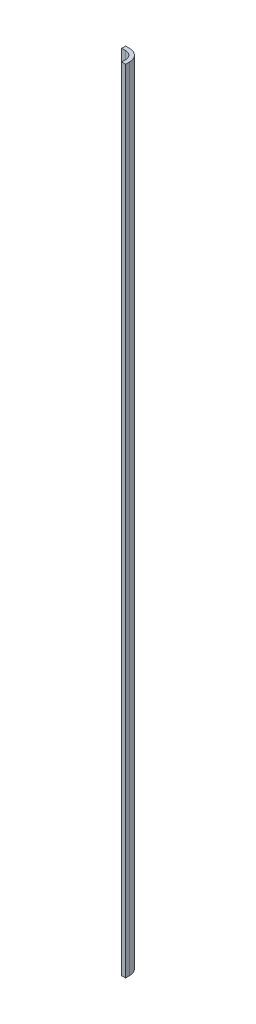
ISO-10303-21;
HEADER;
FILE_DESCRIPTION(('STEP AP214'),'2;1');
FILE_NAME('part.step','',(''),(''),'','','');
FILE_SCHEMA(('AUTOMOTIVE_DESIGN { 1 0 10303 214 1 1 1 1 }'));
ENDSEC;
DATA;
#1=APPLICATION_CONTEXT('core data for automotive mechanical design processes');
#2=APPLICATION_PROTOCOL_DEFINITION('international standard','automotive_design',2000,#1);
#3=PRODUCT_CONTEXT('',#1,'mechanical');
#4=PRODUCT('Part','Part','',(#3));
#5=PRODUCT_RELATED_PRODUCT_CATEGORY('part','',(#4));
#6=PRODUCT_DEFINITION_FORMATION('','',#4);
#7=PRODUCT_DEFINITION_CONTEXT('part definition',#1,'design');
#8=PRODUCT_DEFINITION('design','',#6,#7);
#9=PRODUCT_DEFINITION_SHAPE('','',#8);
#10=(LENGTH_UNIT() NAMED_UNIT(*) SI_UNIT(.MILLI.,.METRE.));
#11=(NAMED_UNIT(*) PLANE_ANGLE_UNIT() SI_UNIT($,.RADIAN.));
#12=(NAMED_UNIT(*) SI_UNIT($,.STERADIAN.) SOLID_ANGLE_UNIT());
#13=UNCERTAINTY_MEASURE_WITH_UNIT(LENGTH_MEASURE(1.E-05),#10,'distance_accuracy_value','');
#14=(GEOMETRIC_REPRESENTATION_CONTEXT(3) GLOBAL_UNCERTAINTY_ASSIGNED_CONTEXT((#13)) GLOBAL_UNIT_ASSIGNED_CONTEXT((#10,
#11,#12)) REPRESENTATION_CONTEXT('',''));
#15=CARTESIAN_POINT('',(0.,0.,0.));
#16=DIRECTION('',(0.,0.,1.));
#17=DIRECTION('',(1.,0.,0.));
#18=AXIS2_PLACEMENT_3D('',#15,#16,#17);
#19=CARTESIAN_POINT('',(33.1600262757253,400.,-28.4159164750318));
#20=DIRECTION('',(0.,-1.,0.));
#21=DIRECTION('',(0.,0.,-1.));
#22=AXIS2_PLACEMENT_3D('',#19,#20,#21);
#23=CYLINDRICAL_SURFACE('',#22,4.);
#24=CARTESIAN_POINT('',(33.1600262757253,0.,-28.4159164750318));
#25=DIRECTION('',(0.,-1.,0.));
#26=DIRECTION('',(0.,0.,-1.));
#27=AXIS2_PLACEMENT_3D('',#24,#25,#26);
#28=CIRCLE('',#27,4.);
#29=CARTESIAN_POINT('',(33.1600262757253,0.,-32.4159164750318));
#30=VERTEX_POINT('',#29);
#31=CARTESIAN_POINT('',(37.1600262757253,0.,-28.4159164750318));
#32=VERTEX_POINT('',#31);
#33=EDGE_CURVE('E143',#30,#32,#28,.T.);
#34=ORIENTED_EDGE('',*,*,#33,.T.);
#35=DIRECTION('',(0.,-1.,0.));
#36=VECTOR('',#35,1.);
#37=CARTESIAN_POINT('',(37.1600262757253,400.,-28.4159164750318));
#38=LINE('',#37,#36);
#39=CARTESIAN_POINT('',(37.1600262757253,400.,-28.4159164750318));
#40=VERTEX_POINT('',#39);
#41=EDGE_CURVE('E11',#40,#32,#38,.T.);
#42=ORIENTED_EDGE('',*,*,#41,.F.);
#43=CARTESIAN_POINT('',(33.1600262757253,400.,-28.4159164750318));
#44=DIRECTION('',(0.,-1.,0.));
#45=DIRECTION('',(0.,0.,-1.));
#46=AXIS2_PLACEMENT_3D('',#43,#44,#45);
#47=CIRCLE('',#46,4.);
#48=CARTESIAN_POINT('',(33.1600262757253,400.,-32.4159164750318));
#49=VERTEX_POINT('',#48);
#50=EDGE_CURVE('E168',#49,#40,#47,.T.);
#51=ORIENTED_EDGE('',*,*,#50,.F.);
#52=DIRECTION('',(0.,-1.,0.));
#53=VECTOR('',#52,1.);
#54=CARTESIAN_POINT('',(33.1600262757253,400.,-32.4159164750318));
#55=LINE('',#54,#53);
#56=EDGE_CURVE('E142',#49,#30,#55,.T.);
#57=ORIENTED_EDGE('',*,*,#56,.T.);
#58=EDGE_LOOP('',(#34,#42,#51,#57));
#59=FACE_BOUND('',#58,.T.);
#60=ADVANCED_FACE('F39',(#59),#23,.F.);
#61=CARTESIAN_POINT('',(37.1600262757253,400.,-28.4159164750318));
#62=DIRECTION('',(1.,0.,0.));
#63=DIRECTION('',(0.,0.,-1.));
#64=AXIS2_PLACEMENT_3D('',#61,#62,#63);
#65=PLANE('',#64);
#66=DIRECTION('',(0.,0.,1.));
#67=VECTOR('',#66,1.);
#68=CARTESIAN_POINT('',(37.1600262757253,0.,-28.4159164750318));
#69=LINE('',#68,#67);
#70=CARTESIAN_POINT('',(37.1600262757253,0.,-26.4159164750318));
#71=VERTEX_POINT('',#70);
#72=EDGE_CURVE('E147',#32,#71,#69,.T.);
#73=ORIENTED_EDGE('',*,*,#72,.T.);
#74=DIRECTION('',(0.,-1.,0.));
#75=VECTOR('',#74,1.);
#76=CARTESIAN_POINT('',(37.1600262757253,400.,-26.4159164750318));
#77=LINE('',#76,#75);
#78=CARTESIAN_POINT('',(37.1600262757253,400.,-26.4159164750318));
#79=VERTEX_POINT('',#78);
#80=EDGE_CURVE('E48',#79,#71,#77,.T.);
#81=ORIENTED_EDGE('',*,*,#80,.F.);
#82=DIRECTION('',(0.,0.,1.));
#83=VECTOR('',#82,1.);
#84=CARTESIAN_POINT('',(37.1600262757253,400.,-28.4159164750318));
#85=LINE('',#84,#83);
#86=EDGE_CURVE('E98',#40,#79,#85,.T.);
#87=ORIENTED_EDGE('',*,*,#86,.F.);
#88=ORIENTED_EDGE('',*,*,#41,.T.);
#89=EDGE_LOOP('',(#73,#81,#87,#88));
#90=FACE_BOUND('',#89,.T.);
#91=ADVANCED_FACE('F206',(#90),#65,.F.);
#92=CARTESIAN_POINT('',(37.1600262757253,400.,-26.4159164750318));
#93=DIRECTION('',(0.,0.,-1.));
#94=DIRECTION('',(-1.,0.,0.));
#95=AXIS2_PLACEMENT_3D('',#92,#93,#94);
#96=PLANE('',#95);
#97=DIRECTION('',(1.,0.,0.));
#98=VECTOR('',#97,1.);
#99=CARTESIAN_POINT('',(37.1600262757253,0.,-26.4159164750318));
#100=LINE('',#99,#98);
#101=CARTESIAN_POINT('',(39.1600262757253,0.,-26.4159164750318));
#102=VERTEX_POINT('',#101);
#103=EDGE_CURVE('E150',#71,#102,#100,.T.);
#104=ORIENTED_EDGE('',*,*,#103,.T.);
#105=DIRECTION('',(0.,-1.,0.));
#106=VECTOR('',#105,1.);
#107=CARTESIAN_POINT('',(39.1600262757253,400.,-26.4159164750318));
#108=LINE('',#107,#106);
#109=CARTESIAN_POINT('',(39.1600262757253,400.,-26.4159164750318));
#110=VERTEX_POINT('',#109);
#111=EDGE_CURVE('E178',#110,#102,#108,.T.);
#112=ORIENTED_EDGE('',*,*,#111,.F.);
#113=DIRECTION('',(1.,0.,0.));
#114=VECTOR('',#113,1.);
#115=CARTESIAN_POINT('',(37.1600262757253,400.,-26.4159164750318));
#116=LINE('',#115,#114);
#117=EDGE_CURVE('E187',#79,#110,#116,.T.);
#118=ORIENTED_EDGE('',*,*,#117,.F.);
#119=ORIENTED_EDGE('',*,*,#80,.T.);
#120=EDGE_LOOP('',(#104,#112,#118,#119));
#121=FACE_BOUND('',#120,.T.);
#122=ADVANCED_FACE('F185',(#121),#96,.F.);
#123=CARTESIAN_POINT('',(39.1600262757253,400.,-28.4159164750318));
#124=DIRECTION('',(1.,0.,0.));
#125=DIRECTION('',(0.,0.,-1.));
#126=AXIS2_PLACEMENT_3D('',#123,#124,#125);
#127=PLANE('',#126);
#128=DIRECTION('',(0.,0.,1.));
#129=VECTOR('',#128,1.);
#130=CARTESIAN_POINT('',(39.1600262757253,0.,-28.4159164750318));
#131=LINE('',#130,#129);
#132=CARTESIAN_POINT('',(39.1600262757253,0.,-28.4159164750318));
#133=VERTEX_POINT('',#132);
#134=EDGE_CURVE('E154',#133,#102,#131,.T.);
#135=ORIENTED_EDGE('',*,*,#134,.F.);
#136=DIRECTION('',(0.,-1.,0.));
#137=VECTOR('',#136,1.);
#138=CARTESIAN_POINT('',(39.1600262757253,400.,-28.4159164750318));
#139=LINE('',#138,#137);
#140=CARTESIAN_POINT('',(39.1600262757253,400.,-28.4159164750318));
#141=VERTEX_POINT('',#140);
#142=EDGE_CURVE('E175',#141,#133,#139,.T.);
#143=ORIENTED_EDGE('',*,*,#142,.F.);
#144=DIRECTION('',(0.,0.,1.));
#145=VECTOR('',#144,1.);
#146=CARTESIAN_POINT('',(39.1600262757253,400.,-28.4159164750318));
#147=LINE('',#146,#145);
#148=EDGE_CURVE('E136',#141,#110,#147,.T.);
#149=ORIENTED_EDGE('',*,*,#148,.T.);
#150=ORIENTED_EDGE('',*,*,#111,.T.);
#151=EDGE_LOOP('',(#135,#143,#149,#150));
#152=FACE_BOUND('',#151,.T.);
#153=ADVANCED_FACE('F194',(#152),#127,.T.);
#154=CARTESIAN_POINT('',(33.1600262757253,400.,-28.4159164750318));
#155=DIRECTION('',(0.,-1.,0.));
#156=DIRECTION('',(0.,0.,-1.));
#157=AXIS2_PLACEMENT_3D('',#154,#155,#156);
#158=CYLINDRICAL_SURFACE('',#157,6.00000000000001);
#159=CARTESIAN_POINT('',(33.1600262757253,0.,-28.4159164750318));
#160=DIRECTION('',(0.,-1.,0.));
#161=DIRECTION('',(0.,0.,-1.));
#162=AXIS2_PLACEMENT_3D('',#159,#160,#161);
#163=CIRCLE('',#162,6.00000000000001);
#164=CARTESIAN_POINT('',(33.1600262757253,0.,-34.4159164750318));
#165=VERTEX_POINT('',#164);
#166=EDGE_CURVE('E158',#165,#133,#163,.T.);
#167=ORIENTED_EDGE('',*,*,#166,.F.);
#168=DIRECTION('',(0.,-1.,0.));
#169=VECTOR('',#168,1.);
#170=CARTESIAN_POINT('',(33.1600262757253,400.,-34.4159164750318));
#171=LINE('',#170,#169);
#172=CARTESIAN_POINT('',(33.1600262757253,400.,-34.4159164750318));
#173=VERTEX_POINT('',#172);
#174=EDGE_CURVE('E121',#173,#165,#171,.T.);
#175=ORIENTED_EDGE('',*,*,#174,.F.);
#176=CARTESIAN_POINT('',(33.1600262757253,400.,-28.4159164750318));
#177=DIRECTION('',(0.,-1.,0.));
#178=DIRECTION('',(0.,0.,-1.));
#179=AXIS2_PLACEMENT_3D('',#176,#177,#178);
#180=CIRCLE('',#179,6.00000000000001);
#181=EDGE_CURVE('E132',#173,#141,#180,.T.);
#182=ORIENTED_EDGE('',*,*,#181,.T.);
#183=ORIENTED_EDGE('',*,*,#142,.T.);
#184=EDGE_LOOP('',(#167,#175,#182,#183));
#185=FACE_BOUND('',#184,.T.);
#186=ADVANCED_FACE('F216',(#185),#158,.T.);
#187=CARTESIAN_POINT('',(31.1600262757253,400.,-34.4159164750318));
#188=DIRECTION('',(0.,0.,-1.));
#189=DIRECTION('',(-1.,0.,0.));
#190=AXIS2_PLACEMENT_3D('',#187,#188,#189);
#191=PLANE('',#190);
#192=DIRECTION('',(1.,0.,0.));
#193=VECTOR('',#192,1.);
#194=CARTESIAN_POINT('',(31.1600262757253,0.,-34.4159164750318));
#195=LINE('',#194,#193);
#196=CARTESIAN_POINT('',(31.1600262757253,0.,-34.4159164750318));
#197=VERTEX_POINT('',#196);
#198=EDGE_CURVE('E119',#197,#165,#195,.T.);
#199=ORIENTED_EDGE('',*,*,#198,.F.);
#200=DIRECTION('',(0.,-1.,0.));
#201=VECTOR('',#200,1.);
#202=CARTESIAN_POINT('',(31.1600262757253,400.,-34.4159164750318));
#203=LINE('',#202,#201);
#204=CARTESIAN_POINT('',(31.1600262757253,400.,-34.4159164750318));
#205=VERTEX_POINT('',#204);
#206=EDGE_CURVE('E113',#205,#197,#203,.T.);
#207=ORIENTED_EDGE('',*,*,#206,.F.);
#208=DIRECTION('',(1.,0.,0.));
#209=VECTOR('',#208,1.);
#210=CARTESIAN_POINT('',(31.1600262757253,400.,-34.4159164750318));
#211=LINE('',#210,#209);
#212=EDGE_CURVE('E117',#205,#173,#211,.T.);
#213=ORIENTED_EDGE('',*,*,#212,.T.);
#214=ORIENTED_EDGE('',*,*,#174,.T.);
#215=EDGE_LOOP('',(#199,#207,#213,#214));
#216=FACE_BOUND('',#215,.T.);
#217=ADVANCED_FACE('F115',(#216),#191,.T.);
#218=CARTESIAN_POINT('',(31.1600262757253,400.,-34.4159164750318));
#219=DIRECTION('',(1.,0.,0.));
#220=DIRECTION('',(0.,0.,-1.));
#221=AXIS2_PLACEMENT_3D('',#218,#219,#220);
#222=PLANE('',#221);
#223=DIRECTION('',(0.,0.,1.));
#224=VECTOR('',#223,1.);
#225=CARTESIAN_POINT('',(31.1600262757253,0.,-34.4159164750318));
#226=LINE('',#225,#224);
#227=CARTESIAN_POINT('',(31.1600262757253,0.,-32.4159164750318));
#228=VERTEX_POINT('',#227);
#229=EDGE_CURVE('E84',#197,#228,#226,.T.);
#230=ORIENTED_EDGE('',*,*,#229,.T.);
#231=DIRECTION('',(0.,-1.,0.));
#232=VECTOR('',#231,1.);
#233=CARTESIAN_POINT('',(31.1600262757253,400.,-32.4159164750318));
#234=LINE('',#233,#232);
#235=CARTESIAN_POINT('',(31.1600262757253,400.,-32.4159164750318));
#236=VERTEX_POINT('',#235);
#237=EDGE_CURVE('E122',#236,#228,#234,.T.);
#238=ORIENTED_EDGE('',*,*,#237,.F.);
#239=DIRECTION('',(0.,0.,1.));
#240=VECTOR('',#239,1.);
#241=CARTESIAN_POINT('',(31.1600262757253,400.,-34.4159164750318));
#242=LINE('',#241,#240);
#243=EDGE_CURVE('E124',#205,#236,#242,.T.);
#244=ORIENTED_EDGE('',*,*,#243,.F.);
#245=ORIENTED_EDGE('',*,*,#206,.T.);
#246=EDGE_LOOP('',(#230,#238,#244,#245));
#247=FACE_BOUND('',#246,.T.);
#248=ADVANCED_FACE('F125',(#247),#222,.F.);
#249=CARTESIAN_POINT('',(31.1600262757253,400.,-32.4159164750318));
#250=DIRECTION('',(0.,0.,-1.));
#251=DIRECTION('',(-1.,0.,0.));
#252=AXIS2_PLACEMENT_3D('',#249,#250,#251);
#253=PLANE('',#252);
#254=DIRECTION('',(1.,0.,0.));
#255=VECTOR('',#254,1.);
#256=CARTESIAN_POINT('',(31.1600262757253,0.,-32.4159164750318));
#257=LINE('',#256,#255);
#258=EDGE_CURVE('E90',#228,#30,#257,.T.);
#259=ORIENTED_EDGE('',*,*,#258,.T.);
#260=ORIENTED_EDGE('',*,*,#56,.F.);
#261=DIRECTION('',(1.,0.,0.));
#262=VECTOR('',#261,1.);
#263=CARTESIAN_POINT('',(31.1600262757253,400.,-32.4159164750318));
#264=LINE('',#263,#262);
#265=EDGE_CURVE('E56',#236,#49,#264,.T.);
#266=ORIENTED_EDGE('',*,*,#265,.F.);
#267=ORIENTED_EDGE('',*,*,#237,.T.);
#268=EDGE_LOOP('',(#259,#260,#266,#267));
#269=FACE_BOUND('',#268,.T.);
#270=ADVANCED_FACE('F224',(#269),#253,.F.);
#271=CARTESIAN_POINT('',(33.1600262757253,400.,-28.4159164750318));
#272=DIRECTION('',(0.,-1.,0.));
#273=DIRECTION('',(0.,0.,-1.));
#274=AXIS2_PLACEMENT_3D('',#271,#272,#273);
#275=PLANE('',#274);
#276=ORIENTED_EDGE('',*,*,#50,.T.);
#277=ORIENTED_EDGE('',*,*,#86,.T.);
#278=ORIENTED_EDGE('',*,*,#117,.T.);
#279=ORIENTED_EDGE('',*,*,#148,.F.);
#280=ORIENTED_EDGE('',*,*,#181,.F.);
#281=ORIENTED_EDGE('',*,*,#212,.F.);
#282=ORIENTED_EDGE('',*,*,#243,.T.);
#283=ORIENTED_EDGE('',*,*,#265,.T.);
#284=EDGE_LOOP('',(#276,#277,#278,#279,#280,#281,#282,#283));
#285=FACE_BOUND('',#284,.T.);
#286=ADVANCED_FACE('F129',(#285),#275,.F.);
#287=CARTESIAN_POINT('',(33.1600262757253,0.,-28.4159164750318));
#288=DIRECTION('',(0.,-1.,0.));
#289=DIRECTION('',(0.,0.,-1.));
#290=AXIS2_PLACEMENT_3D('',#287,#288,#289);
#291=PLANE('',#290);
#292=ORIENTED_EDGE('',*,*,#33,.F.);
#293=ORIENTED_EDGE('',*,*,#258,.F.);
#294=ORIENTED_EDGE('',*,*,#229,.F.);
#295=ORIENTED_EDGE('',*,*,#198,.T.);
#296=ORIENTED_EDGE('',*,*,#166,.T.);
#297=ORIENTED_EDGE('',*,*,#134,.T.);
#298=ORIENTED_EDGE('',*,*,#103,.F.);
#299=ORIENTED_EDGE('',*,*,#72,.F.);
#300=EDGE_LOOP('',(#292,#293,#294,#295,#296,#297,#298,#299));
#301=FACE_BOUND('',#300,.T.);
#302=ADVANCED_FACE('F190',(#301),#291,.T.);
#303=CLOSED_SHELL('',(#60,#91,#122,#153,#186,#217,#248,#270,#286,#302));
#304=MANIFOLD_SOLID_BREP('B2',#303);
#305=ADVANCED_BREP_SHAPE_REPRESENTATION('',(#18,#304),#14);
#306=SHAPE_DEFINITION_REPRESENTATION(#9,#305);
ENDSEC;
END-ISO-10303-21;
